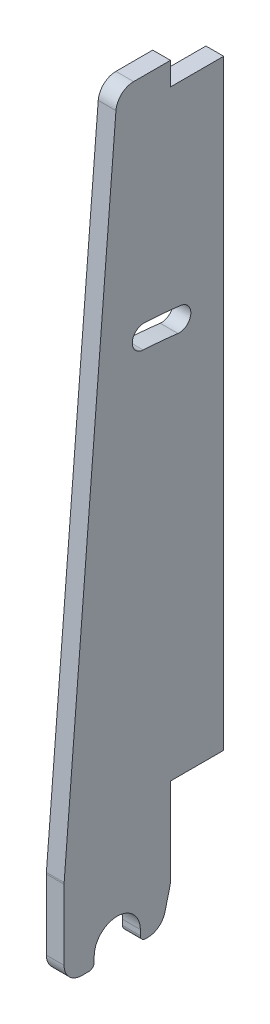
ISO-10303-21;
HEADER;
FILE_DESCRIPTION(('STEP AP214'),'2;1');
FILE_NAME('part.step','',(''),(''),'','','');
FILE_SCHEMA(('AUTOMOTIVE_DESIGN { 1 0 10303 214 1 1 1 1 }'));
ENDSEC;
DATA;
#1=APPLICATION_CONTEXT('core data for automotive mechanical design processes');
#2=APPLICATION_PROTOCOL_DEFINITION('international standard','automotive_design',2000,#1);
#3=PRODUCT_CONTEXT('',#1,'mechanical');
#4=PRODUCT('Part','Part','',(#3));
#5=PRODUCT_RELATED_PRODUCT_CATEGORY('part','',(#4));
#6=PRODUCT_DEFINITION_FORMATION('','',#4);
#7=PRODUCT_DEFINITION_CONTEXT('part definition',#1,'design');
#8=PRODUCT_DEFINITION('design','',#6,#7);
#9=PRODUCT_DEFINITION_SHAPE('','',#8);
#10=(LENGTH_UNIT() NAMED_UNIT(*) SI_UNIT(.MILLI.,.METRE.));
#11=(NAMED_UNIT(*) PLANE_ANGLE_UNIT() SI_UNIT($,.RADIAN.));
#12=(NAMED_UNIT(*) SI_UNIT($,.STERADIAN.) SOLID_ANGLE_UNIT());
#13=UNCERTAINTY_MEASURE_WITH_UNIT(LENGTH_MEASURE(1.E-05),#10,'distance_accuracy_value','');
#14=(GEOMETRIC_REPRESENTATION_CONTEXT(3) GLOBAL_UNCERTAINTY_ASSIGNED_CONTEXT((#13)) GLOBAL_UNIT_ASSIGNED_CONTEXT((#10,
#11,#12)) REPRESENTATION_CONTEXT('',''));
#15=CARTESIAN_POINT('',(0.,0.,0.));
#16=DIRECTION('',(0.,0.,1.));
#17=DIRECTION('',(1.,0.,0.));
#18=AXIS2_PLACEMENT_3D('',#15,#16,#17);
#19=CARTESIAN_POINT('',(5.,352.,-30.));
#20=DIRECTION('',(0.,0.,1.));
#21=DIRECTION('',(0.,-1.,0.));
#22=AXIS2_PLACEMENT_3D('',#19,#20,#21);
#23=PLANE('',#22);
#24=DIRECTION('',(0.,1.,0.));
#25=VECTOR('',#24,1.);
#26=CARTESIAN_POINT('',(-5.,352.,-30.));
#27=LINE('',#26,#25);
#28=CARTESIAN_POINT('',(-5.,0.,-30.));
#29=VERTEX_POINT('',#28);
#30=CARTESIAN_POINT('',(-5.,339.,-30.));
#31=VERTEX_POINT('',#30);
#32=EDGE_CURVE('E325',#29,#31,#27,.T.);
#33=ORIENTED_EDGE('',*,*,#32,.T.);
#34=DIRECTION('',(1.,0.,0.));
#35=VECTOR('',#34,1.);
#36=CARTESIAN_POINT('',(-5.,339.,-30.));
#37=LINE('',#36,#35);
#38=CARTESIAN_POINT('',(5.,339.,-30.));
#39=VERTEX_POINT('',#38);
#40=EDGE_CURVE('E321',#31,#39,#37,.T.);
#41=ORIENTED_EDGE('',*,*,#40,.T.);
#42=DIRECTION('',(0.,1.,0.));
#43=VECTOR('',#42,1.);
#44=CARTESIAN_POINT('',(5.,352.,-30.));
#45=LINE('',#44,#43);
#46=CARTESIAN_POINT('',(5.,0.,-30.));
#47=VERTEX_POINT('',#46);
#48=EDGE_CURVE('E331',#47,#39,#45,.T.);
#49=ORIENTED_EDGE('',*,*,#48,.F.);
#50=DIRECTION('',(-1.,0.,0.));
#51=VECTOR('',#50,1.);
#52=CARTESIAN_POINT('',(5.,0.,-30.));
#53=LINE('',#52,#51);
#54=EDGE_CURVE('E374',#47,#29,#53,.T.);
#55=ORIENTED_EDGE('',*,*,#54,.T.);
#56=EDGE_LOOP('',(#33,#41,#49,#55));
#57=FACE_BOUND('',#56,.T.);
#58=ADVANCED_FACE('F47',(#57),#23,.F.);
#59=CARTESIAN_POINT('',(5.,352.,30.));
#60=DIRECTION('',(0.,-1.,0.));
#61=DIRECTION('',(0.,0.,-1.));
#62=AXIS2_PLACEMENT_3D('',#59,#60,#61);
#63=PLANE('',#62);
#64=DIRECTION('',(0.,0.,1.));
#65=VECTOR('',#64,1.);
#66=CARTESIAN_POINT('',(5.,352.,30.));
#67=LINE('',#66,#65);
#68=CARTESIAN_POINT('',(5.,352.,0.));
#69=VERTEX_POINT('',#68);
#70=CARTESIAN_POINT('',(5.,352.,20.7739861031717));
#71=VERTEX_POINT('',#70);
#72=EDGE_CURVE('E335',#69,#71,#67,.T.);
#73=ORIENTED_EDGE('',*,*,#72,.F.);
#74=DIRECTION('',(1.,0.,0.));
#75=VECTOR('',#74,1.);
#76=CARTESIAN_POINT('',(-5.,352.,0.));
#77=LINE('',#76,#75);
#78=CARTESIAN_POINT('',(-5.,352.,0.));
#79=VERTEX_POINT('',#78);
#80=EDGE_CURVE('E315',#79,#69,#77,.T.);
#81=ORIENTED_EDGE('',*,*,#80,.F.);
#82=DIRECTION('',(0.,0.,1.));
#83=VECTOR('',#82,1.);
#84=CARTESIAN_POINT('',(-5.,352.,30.));
#85=LINE('',#84,#83);
#86=CARTESIAN_POINT('',(-5.,352.,20.7739861031717));
#87=VERTEX_POINT('',#86);
#88=EDGE_CURVE('E378',#79,#87,#85,.T.);
#89=ORIENTED_EDGE('',*,*,#88,.T.);
#90=DIRECTION('',(-1.,0.,0.));
#91=VECTOR('',#90,1.);
#92=CARTESIAN_POINT('',(5.,352.,20.7739861031717));
#93=LINE('',#92,#91);
#94=EDGE_CURVE('E495',#87,#71,#93,.F.);
#95=ORIENTED_EDGE('',*,*,#94,.T.);
#96=EDGE_LOOP('',(#73,#81,#89,#95));
#97=FACE_BOUND('',#96,.T.);
#98=ADVANCED_FACE('F584',(#97),#63,.F.);
#99=CARTESIAN_POINT('',(5.,-20.,60.));
#100=DIRECTION('',(0.,-0.0803841899203099,-0.996763955011845));
#101=DIRECTION('',(0.,0.996763955011845,-0.0803841899203099));
#102=AXIS2_PLACEMENT_3D('',#99,#100,#101);
#103=PLANE('',#102);
#104=DIRECTION('',(0.,-0.996763955011845,0.0803841899203099));
#105=VECTOR('',#104,1.);
#106=CARTESIAN_POINT('',(-5.,-20.,60.));
#107=LINE('',#106,#105);
#108=CARTESIAN_POINT('',(-5.,342.803841899203,30.7416256532901));
#109=VERTEX_POINT('',#108);
#110=CARTESIAN_POINT('',(-5.,-19.5987304214688,59.9676395501184));
#111=VERTEX_POINT('',#110);
#112=EDGE_CURVE('E381',#109,#111,#107,.T.);
#113=ORIENTED_EDGE('',*,*,#112,.T.);
#114=DIRECTION('',(-1.,0.,0.));
#115=VECTOR('',#114,1.);
#116=CARTESIAN_POINT('',(5.,-19.5987304214688,59.9676395501184));
#117=LINE('',#116,#115);
#118=CARTESIAN_POINT('',(5.,-19.5987304214688,59.9676395501184));
#119=VERTEX_POINT('',#118);
#120=EDGE_CURVE('E458',#111,#119,#117,.F.);
#121=ORIENTED_EDGE('',*,*,#120,.T.);
#122=DIRECTION('',(0.,-0.996763955011845,0.0803841899203099));
#123=VECTOR('',#122,1.);
#124=CARTESIAN_POINT('',(5.,-20.,60.));
#125=LINE('',#124,#123);
#126=CARTESIAN_POINT('',(5.,342.803841899203,30.7416256532901));
#127=VERTEX_POINT('',#126);
#128=EDGE_CURVE('E339',#127,#119,#125,.T.);
#129=ORIENTED_EDGE('',*,*,#128,.F.);
#130=DIRECTION('',(-1.,0.,0.));
#131=VECTOR('',#130,1.);
#132=CARTESIAN_POINT('',(5.,342.803841899203,30.7416256532901));
#133=LINE('',#132,#131);
#134=EDGE_CURVE('E454',#127,#109,#133,.T.);
#135=ORIENTED_EDGE('',*,*,#134,.T.);
#136=EDGE_LOOP('',(#113,#121,#129,#135));
#137=FACE_BOUND('',#136,.T.);
#138=ADVANCED_FACE('F592',(#137),#103,.F.);
#139=CARTESIAN_POINT('',(5.,-70.,60.));
#140=DIRECTION('',(0.,0.,-1.));
#141=DIRECTION('',(0.,1.,0.));
#142=AXIS2_PLACEMENT_3D('',#139,#140,#141);
#143=PLANE('',#142);
#144=DIRECTION('',(0.,-1.,0.));
#145=VECTOR('',#144,1.);
#146=CARTESIAN_POINT('',(5.,-70.,60.));
#147=LINE('',#146,#145);
#148=CARTESIAN_POINT('',(5.,-20.4025723206719,60.));
#149=VERTEX_POINT('',#148);
#150=CARTESIAN_POINT('',(5.,-60.,60.));
#151=VERTEX_POINT('',#150);
#152=EDGE_CURVE('E343',#149,#151,#147,.T.);
#153=ORIENTED_EDGE('',*,*,#152,.F.);
#154=DIRECTION('',(-1.,0.,0.));
#155=VECTOR('',#154,1.);
#156=CARTESIAN_POINT('',(5.,-20.4025723206719,60.));
#157=LINE('',#156,#155);
#158=CARTESIAN_POINT('',(-5.,-20.4025723206719,60.));
#159=VERTEX_POINT('',#158);
#160=EDGE_CURVE('E433',#149,#159,#157,.T.);
#161=ORIENTED_EDGE('',*,*,#160,.T.);
#162=DIRECTION('',(0.,-1.,0.));
#163=VECTOR('',#162,1.);
#164=CARTESIAN_POINT('',(-5.,-70.,60.));
#165=LINE('',#164,#163);
#166=CARTESIAN_POINT('',(-5.,-60.,60.));
#167=VERTEX_POINT('',#166);
#168=EDGE_CURVE('E385',#159,#167,#165,.T.);
#169=ORIENTED_EDGE('',*,*,#168,.T.);
#170=DIRECTION('',(-1.,0.,0.));
#171=VECTOR('',#170,1.);
#172=CARTESIAN_POINT('',(5.,-60.,60.));
#173=LINE('',#172,#171);
#174=EDGE_CURVE('E430',#167,#151,#173,.F.);
#175=ORIENTED_EDGE('',*,*,#174,.T.);
#176=EDGE_LOOP('',(#153,#161,#169,#175));
#177=FACE_BOUND('',#176,.T.);
#178=ADVANCED_FACE('F603',(#177),#143,.F.);
#179=CARTESIAN_POINT('',(5.,-70.,43.));
#180=DIRECTION('',(0.,1.,0.));
#181=DIRECTION('',(0.,0.,1.));
#182=AXIS2_PLACEMENT_3D('',#179,#180,#181);
#183=PLANE('',#182);
#184=DIRECTION('',(0.,0.,-1.));
#185=VECTOR('',#184,1.);
#186=CARTESIAN_POINT('',(-5.,-70.,43.));
#187=LINE('',#186,#185);
#188=CARTESIAN_POINT('',(-5.,-70.,50.));
#189=VERTEX_POINT('',#188);
#190=CARTESIAN_POINT('',(-5.,-70.,46.));
#191=VERTEX_POINT('',#190);
#192=EDGE_CURVE('E389',#189,#191,#187,.T.);
#193=ORIENTED_EDGE('',*,*,#192,.T.);
#194=DIRECTION('',(-1.,0.,0.));
#195=VECTOR('',#194,1.);
#196=CARTESIAN_POINT('',(5.,-70.,46.));
#197=LINE('',#196,#195);
#198=CARTESIAN_POINT('',(5.,-70.,46.));
#199=VERTEX_POINT('',#198);
#200=EDGE_CURVE('E11',#191,#199,#197,.F.);
#201=ORIENTED_EDGE('',*,*,#200,.T.);
#202=DIRECTION('',(0.,0.,-1.));
#203=VECTOR('',#202,1.);
#204=CARTESIAN_POINT('',(5.,-70.,43.));
#205=LINE('',#204,#203);
#206=CARTESIAN_POINT('',(5.,-70.,50.));
#207=VERTEX_POINT('',#206);
#208=EDGE_CURVE('E347',#207,#199,#205,.T.);
#209=ORIENTED_EDGE('',*,*,#208,.F.);
#210=DIRECTION('',(-1.,0.,0.));
#211=VECTOR('',#210,1.);
#212=CARTESIAN_POINT('',(5.,-70.,50.));
#213=LINE('',#212,#211);
#214=EDGE_CURVE('E476',#207,#189,#213,.T.);
#215=ORIENTED_EDGE('',*,*,#214,.T.);
#216=EDGE_LOOP('',(#193,#201,#209,#215));
#217=FACE_BOUND('',#216,.T.);
#218=ADVANCED_FACE('F610',(#217),#183,.F.);
#219=CARTESIAN_POINT('',(5.,-64.,43.));
#220=DIRECTION('',(0.,0.,1.));
#221=DIRECTION('',(0.,-1.,0.));
#222=AXIS2_PLACEMENT_3D('',#219,#220,#221);
#223=PLANE('',#222);
#224=DIRECTION('',(0.,1.,0.));
#225=VECTOR('',#224,1.);
#226=CARTESIAN_POINT('',(5.,-64.,43.));
#227=LINE('',#226,#225);
#228=CARTESIAN_POINT('',(5.,-67.,43.));
#229=VERTEX_POINT('',#228);
#230=CARTESIAN_POINT('',(5.,-64.,43.));
#231=VERTEX_POINT('',#230);
#232=EDGE_CURVE('E351',#229,#231,#227,.T.);
#233=ORIENTED_EDGE('',*,*,#232,.F.);
#234=DIRECTION('',(-1.,0.,0.));
#235=VECTOR('',#234,1.);
#236=CARTESIAN_POINT('',(5.,-67.,43.));
#237=LINE('',#236,#235);
#238=CARTESIAN_POINT('',(-5.,-67.,43.));
#239=VERTEX_POINT('',#238);
#240=EDGE_CURVE('E56',#229,#239,#237,.T.);
#241=ORIENTED_EDGE('',*,*,#240,.T.);
#242=DIRECTION('',(0.,1.,0.));
#243=VECTOR('',#242,1.);
#244=CARTESIAN_POINT('',(-5.,-64.,43.));
#245=LINE('',#244,#243);
#246=CARTESIAN_POINT('',(-5.,-64.,43.));
#247=VERTEX_POINT('',#246);
#248=EDGE_CURVE('E393',#239,#247,#245,.T.);
#249=ORIENTED_EDGE('',*,*,#248,.T.);
#250=DIRECTION('',(-1.,0.,0.));
#251=VECTOR('',#250,1.);
#252=CARTESIAN_POINT('',(5.,-64.,43.));
#253=LINE('',#252,#251);
#254=EDGE_CURVE('E426',#231,#247,#253,.T.);
#255=ORIENTED_EDGE('',*,*,#254,.F.);
#256=EDGE_LOOP('',(#233,#241,#249,#255));
#257=FACE_BOUND('',#256,.T.);
#258=ADVANCED_FACE('F523',(#257),#223,.F.);
#259=CARTESIAN_POINT('',(5.,-64.,30.));
#260=DIRECTION('',(-1.,0.,0.));
#261=DIRECTION('',(0.,0.,1.));
#262=AXIS2_PLACEMENT_3D('',#259,#260,#261);
#263=CYLINDRICAL_SURFACE('',#262,13.);
#264=CARTESIAN_POINT('',(-5.,-64.,30.));
#265=DIRECTION('',(-1.,0.,0.));
#266=DIRECTION('',(0.,0.,1.));
#267=AXIS2_PLACEMENT_3D('',#264,#265,#266);
#268=CIRCLE('',#267,13.);
#269=CARTESIAN_POINT('',(-5.,-64.,17.));
#270=VERTEX_POINT('',#269);
#271=EDGE_CURVE('E396',#247,#270,#268,.T.);
#272=ORIENTED_EDGE('',*,*,#271,.T.);
#273=DIRECTION('',(-1.,0.,0.));
#274=VECTOR('',#273,1.);
#275=CARTESIAN_POINT('',(5.,-64.,17.));
#276=LINE('',#275,#274);
#277=CARTESIAN_POINT('',(5.,-64.,17.));
#278=VERTEX_POINT('',#277);
#279=EDGE_CURVE('E422',#278,#270,#276,.T.);
#280=ORIENTED_EDGE('',*,*,#279,.F.);
#281=CARTESIAN_POINT('',(5.,-64.,30.));
#282=DIRECTION('',(-1.,0.,0.));
#283=DIRECTION('',(0.,0.,1.));
#284=AXIS2_PLACEMENT_3D('',#281,#282,#283);
#285=CIRCLE('',#284,13.);
#286=EDGE_CURVE('E354',#231,#278,#285,.T.);
#287=ORIENTED_EDGE('',*,*,#286,.F.);
#288=ORIENTED_EDGE('',*,*,#254,.T.);
#289=EDGE_LOOP('',(#272,#280,#287,#288));
#290=FACE_BOUND('',#289,.T.);
#291=ADVANCED_FACE('F532',(#290),#263,.F.);
#292=CARTESIAN_POINT('',(5.,-64.,17.));
#293=DIRECTION('',(0.,0.,-1.));
#294=DIRECTION('',(-1.,0.,0.));
#295=AXIS2_PLACEMENT_3D('',#292,#293,#294);
#296=PLANE('',#295);
#297=DIRECTION('',(0.,-1.,0.));
#298=VECTOR('',#297,1.);
#299=CARTESIAN_POINT('',(-5.,-64.,17.));
#300=LINE('',#299,#298);
#301=CARTESIAN_POINT('',(-5.,-67.,17.));
#302=VERTEX_POINT('',#301);
#303=EDGE_CURVE('E399',#270,#302,#300,.T.);
#304=ORIENTED_EDGE('',*,*,#303,.T.);
#305=DIRECTION('',(-1.,0.,0.));
#306=VECTOR('',#305,1.);
#307=CARTESIAN_POINT('',(5.,-67.,17.));
#308=LINE('',#307,#306);
#309=CARTESIAN_POINT('',(5.,-67.,17.));
#310=VERTEX_POINT('',#309);
#311=EDGE_CURVE('E509',#302,#310,#308,.F.);
#312=ORIENTED_EDGE('',*,*,#311,.T.);
#313=DIRECTION('',(0.,-1.,0.));
#314=VECTOR('',#313,1.);
#315=CARTESIAN_POINT('',(5.,-64.,17.));
#316=LINE('',#315,#314);
#317=EDGE_CURVE('E357',#278,#310,#316,.T.);
#318=ORIENTED_EDGE('',*,*,#317,.F.);
#319=ORIENTED_EDGE('',*,*,#279,.T.);
#320=EDGE_LOOP('',(#304,#312,#318,#319));
#321=FACE_BOUND('',#320,.T.);
#322=ADVANCED_FACE('F536',(#321),#296,.F.);
#323=CARTESIAN_POINT('',(5.,-70.,4.99999999999999));
#324=DIRECTION('',(0.,1.,0.));
#325=DIRECTION('',(0.,0.,1.));
#326=AXIS2_PLACEMENT_3D('',#323,#324,#325);
#327=PLANE('',#326);
#328=DIRECTION('',(0.,0.,-1.));
#329=VECTOR('',#328,1.);
#330=CARTESIAN_POINT('',(5.,-70.,4.99999999999999));
#331=LINE('',#330,#329);
#332=CARTESIAN_POINT('',(5.,-70.,14.));
#333=VERTEX_POINT('',#332);
#334=CARTESIAN_POINT('',(5.,-70.,12.8077640640441));
#335=VERTEX_POINT('',#334);
#336=EDGE_CURVE('E361',#333,#335,#331,.T.);
#337=ORIENTED_EDGE('',*,*,#336,.F.);
#338=DIRECTION('',(-1.,0.,0.));
#339=VECTOR('',#338,1.);
#340=CARTESIAN_POINT('',(5.,-70.,14.));
#341=LINE('',#340,#339);
#342=CARTESIAN_POINT('',(-5.,-70.,14.));
#343=VERTEX_POINT('',#342);
#344=EDGE_CURVE('E499',#333,#343,#341,.T.);
#345=ORIENTED_EDGE('',*,*,#344,.T.);
#346=DIRECTION('',(0.,0.,-1.));
#347=VECTOR('',#346,1.);
#348=CARTESIAN_POINT('',(-5.,-70.,4.99999999999999));
#349=LINE('',#348,#347);
#350=CARTESIAN_POINT('',(-5.,-70.,12.8077640640441));
#351=VERTEX_POINT('',#350);
#352=EDGE_CURVE('E403',#343,#351,#349,.T.);
#353=ORIENTED_EDGE('',*,*,#352,.T.);
#354=DIRECTION('',(-1.,0.,0.));
#355=VECTOR('',#354,1.);
#356=CARTESIAN_POINT('',(5.,-70.,12.8077640640441));
#357=LINE('',#356,#355);
#358=EDGE_CURVE('E487',#351,#335,#357,.F.);
#359=ORIENTED_EDGE('',*,*,#358,.T.);
#360=EDGE_LOOP('',(#337,#345,#353,#359));
#361=FACE_BOUND('',#360,.T.);
#362=ADVANCED_FACE('F547',(#361),#327,.F.);
#363=CARTESIAN_POINT('',(5.,-50.,0.));
#364=DIRECTION('',(0.,0.242535625036333,0.970142500145332));
#365=DIRECTION('',(0.,-0.970142500145332,0.242535625036333));
#366=AXIS2_PLACEMENT_3D('',#363,#364,#365);
#367=PLANE('',#366);
#368=DIRECTION('',(0.,0.970142500145332,-0.242535625036333));
#369=VECTOR('',#368,1.);
#370=CARTESIAN_POINT('',(5.,-50.,0.));
#371=LINE('',#370,#369);
#372=CARTESIAN_POINT('',(5.,-62.4253562503633,3.10633906259082));
#373=VERTEX_POINT('',#372);
#374=CARTESIAN_POINT('',(5.,-51.1942999941867,0.298574998546676));
#375=VERTEX_POINT('',#374);
#376=EDGE_CURVE('E364',#373,#375,#371,.T.);
#377=ORIENTED_EDGE('',*,*,#376,.F.);
#378=DIRECTION('',(-1.,0.,0.));
#379=VECTOR('',#378,1.);
#380=CARTESIAN_POINT('',(5.,-62.4253562503633,3.10633906259082));
#381=LINE('',#380,#379);
#382=CARTESIAN_POINT('',(-5.,-62.4253562503633,3.10633906259082));
#383=VERTEX_POINT('',#382);
#384=EDGE_CURVE('E483',#373,#383,#381,.T.);
#385=ORIENTED_EDGE('',*,*,#384,.T.);
#386=DIRECTION('',(0.,0.970142500145332,-0.242535625036333));
#387=VECTOR('',#386,1.);
#388=CARTESIAN_POINT('',(-5.,-50.,0.));
#389=LINE('',#388,#387);
#390=CARTESIAN_POINT('',(-5.,-51.1942999941867,0.298574998546676));
#391=VERTEX_POINT('',#390);
#392=EDGE_CURVE('E406',#383,#391,#389,.T.);
#393=ORIENTED_EDGE('',*,*,#392,.T.);
#394=DIRECTION('',(-1.,0.,0.));
#395=VECTOR('',#394,1.);
#396=CARTESIAN_POINT('',(5.,-51.1942999941867,0.298574998546676));
#397=LINE('',#396,#395);
#398=EDGE_CURVE('E480',#391,#375,#397,.F.);
#399=ORIENTED_EDGE('',*,*,#398,.T.);
#400=EDGE_LOOP('',(#377,#385,#393,#399));
#401=FACE_BOUND('',#400,.T.);
#402=ADVANCED_FACE('F557',(#401),#367,.F.);
#403=CARTESIAN_POINT('',(5.,0.,0.));
#404=DIRECTION('',(0.,0.,1.));
#405=DIRECTION('',(0.,-1.,0.));
#406=AXIS2_PLACEMENT_3D('',#403,#404,#405);
#407=PLANE('',#406);
#408=DIRECTION('',(0.,1.,0.));
#409=VECTOR('',#408,1.);
#410=CARTESIAN_POINT('',(5.,0.,0.));
#411=LINE('',#410,#409);
#412=CARTESIAN_POINT('',(5.,-48.7689437438234,0.));
#413=VERTEX_POINT('',#412);
#414=CARTESIAN_POINT('',(5.,0.,0.));
#415=VERTEX_POINT('',#414);
#416=EDGE_CURVE('E368',#413,#415,#411,.T.);
#417=ORIENTED_EDGE('',*,*,#416,.F.);
#418=DIRECTION('',(-1.,0.,0.));
#419=VECTOR('',#418,1.);
#420=CARTESIAN_POINT('',(5.,-48.7689437438234,0.));
#421=LINE('',#420,#419);
#422=CARTESIAN_POINT('',(-5.,-48.7689437438234,0.));
#423=VERTEX_POINT('',#422);
#424=EDGE_CURVE('E491',#413,#423,#421,.T.);
#425=ORIENTED_EDGE('',*,*,#424,.T.);
#426=DIRECTION('',(0.,1.,0.));
#427=VECTOR('',#426,1.);
#428=CARTESIAN_POINT('',(-5.,0.,0.));
#429=LINE('',#428,#427);
#430=CARTESIAN_POINT('',(-5.,0.,0.));
#431=VERTEX_POINT('',#430);
#432=EDGE_CURVE('E410',#423,#431,#429,.T.);
#433=ORIENTED_EDGE('',*,*,#432,.T.);
#434=DIRECTION('',(-1.,0.,0.));
#435=VECTOR('',#434,1.);
#436=CARTESIAN_POINT('',(5.,0.,0.));
#437=LINE('',#436,#435);
#438=EDGE_CURVE('E418',#415,#431,#437,.T.);
#439=ORIENTED_EDGE('',*,*,#438,.F.);
#440=EDGE_LOOP('',(#417,#425,#433,#439));
#441=FACE_BOUND('',#440,.T.);
#442=ADVANCED_FACE('F565',(#441),#407,.F.);
#443=CARTESIAN_POINT('',(5.,0.,-30.));
#444=DIRECTION('',(0.,1.,0.));
#445=DIRECTION('',(0.,0.,1.));
#446=AXIS2_PLACEMENT_3D('',#443,#444,#445);
#447=PLANE('',#446);
#448=DIRECTION('',(0.,0.,-1.));
#449=VECTOR('',#448,1.);
#450=CARTESIAN_POINT('',(-5.,0.,-30.));
#451=LINE('',#450,#449);
#452=EDGE_CURVE('E336',#431,#29,#451,.T.);
#453=ORIENTED_EDGE('',*,*,#452,.T.);
#454=ORIENTED_EDGE('',*,*,#54,.F.);
#455=DIRECTION('',(0.,0.,-1.));
#456=VECTOR('',#455,1.);
#457=CARTESIAN_POINT('',(5.,0.,-30.));
#458=LINE('',#457,#456);
#459=EDGE_CURVE('E371',#415,#47,#458,.T.);
#460=ORIENTED_EDGE('',*,*,#459,.F.);
#461=ORIENTED_EDGE('',*,*,#438,.T.);
#462=EDGE_LOOP('',(#453,#454,#460,#461));
#463=FACE_BOUND('',#462,.T.);
#464=ADVANCED_FACE('F571',(#463),#447,.F.);
#465=CARTESIAN_POINT('',(5.,-64.,30.));
#466=DIRECTION('',(-1.,0.,0.));
#467=DIRECTION('',(0.,0.,1.));
#468=AXIS2_PLACEMENT_3D('',#465,#466,#467);
#469=PLANE('',#468);
#470=CARTESIAN_POINT('',(5.,-64.,30.));
#471=DIRECTION('',(1.,0.,0.));
#472=DIRECTION('',(0.,0.,-1.));
#473=AXIS2_PLACEMENT_3D('',#470,#471,#472);
#474=CIRCLE('',#473,295.583033054519);
#475=CARTESIAN_POINT('',(5.,229.410506158611,-5.77155721318653));
#476=VERTEX_POINT('',#475);
#477=CARTESIAN_POINT('',(5.,231.185653535888,14.6781405730391));
#478=VERTEX_POINT('',#477);
#479=EDGE_CURVE('E66',#476,#478,#474,.T.);
#480=ORIENTED_EDGE('',*,*,#479,.F.);
#481=CARTESIAN_POINT('',(5.,222.958280973957,-4.9849250459646));
#482=DIRECTION('',(1.,0.,0.));
#483=DIRECTION('',(0.,0.,-1.));
#484=AXIS2_PLACEMENT_3D('',#481,#482,#483);
#485=CIRCLE('',#484,6.49999999999997);
#486=CARTESIAN_POINT('',(5.,216.506055789302,-4.19829287874265));
#487=VERTEX_POINT('',#486);
#488=EDGE_CURVE('E261',#487,#476,#485,.T.);
#489=ORIENTED_EDGE('',*,*,#488,.F.);
#490=CARTESIAN_POINT('',(5.,-64.,30.));
#491=DIRECTION('',(-1.,0.,0.));
#492=DIRECTION('',(0.,0.,-1.));
#493=AXIS2_PLACEMENT_3D('',#490,#491,#492);
#494=CIRCLE('',#493,282.583033054519);
#495=CARTESIAN_POINT('',(5.,218.203130634248,15.3520093350318));
#496=VERTEX_POINT('',#495);
#497=EDGE_CURVE('E282',#496,#487,#494,.T.);
#498=ORIENTED_EDGE('',*,*,#497,.F.);
#499=CARTESIAN_POINT('',(5.,224.694392085068,15.0150749540354));
#500=DIRECTION('',(1.,0.,0.));
#501=DIRECTION('',(0.,0.,-1.));
#502=AXIS2_PLACEMENT_3D('',#499,#500,#501);
#503=CIRCLE('',#502,6.49999999999997);
#504=EDGE_CURVE('E285',#478,#496,#503,.T.);
#505=ORIENTED_EDGE('',*,*,#504,.F.);
#506=EDGE_LOOP('',(#480,#489,#498,#505));
#507=FACE_BOUND('',#506,.T.);
#508=ORIENTED_EDGE('',*,*,#48,.T.);
#509=DIRECTION('',(0.,0.,-1.));
#510=VECTOR('',#509,1.);
#511=CARTESIAN_POINT('',(5.,339.,-30.));
#512=LINE('',#511,#510);
#513=CARTESIAN_POINT('',(5.,339.,0.));
#514=VERTEX_POINT('',#513);
#515=EDGE_CURVE('E312',#514,#39,#512,.T.);
#516=ORIENTED_EDGE('',*,*,#515,.F.);
#517=DIRECTION('',(0.,-1.,0.));
#518=VECTOR('',#517,1.);
#519=CARTESIAN_POINT('',(5.,339.,0.));
#520=LINE('',#519,#518);
#521=EDGE_CURVE('E302',#69,#514,#520,.T.);
#522=ORIENTED_EDGE('',*,*,#521,.F.);
#523=ORIENTED_EDGE('',*,*,#72,.T.);
#524=CARTESIAN_POINT('',(5.,342.,20.7739861031717));
#525=DIRECTION('',(-1.,0.,0.));
#526=DIRECTION('',(0.,0.,1.));
#527=AXIS2_PLACEMENT_3D('',#524,#525,#526);
#528=CIRCLE('',#527,10.);
#529=EDGE_CURVE('E461',#71,#127,#528,.F.);
#530=ORIENTED_EDGE('',*,*,#529,.T.);
#531=ORIENTED_EDGE('',*,*,#128,.T.);
#532=CARTESIAN_POINT('',(5.,-20.4025723206719,50.));
#533=DIRECTION('',(-1.,0.,0.));
#534=DIRECTION('',(0.,0.,1.));
#535=AXIS2_PLACEMENT_3D('',#532,#533,#534);
#536=CIRCLE('',#535,10.);
#537=EDGE_CURVE('E473',#119,#149,#536,.F.);
#538=ORIENTED_EDGE('',*,*,#537,.T.);
#539=ORIENTED_EDGE('',*,*,#152,.T.);
#540=CARTESIAN_POINT('',(5.,-60.,50.));
#541=DIRECTION('',(-1.,0.,0.));
#542=DIRECTION('',(0.,0.,1.));
#543=AXIS2_PLACEMENT_3D('',#540,#541,#542);
#544=CIRCLE('',#543,10.);
#545=EDGE_CURVE('E470',#151,#207,#544,.F.);
#546=ORIENTED_EDGE('',*,*,#545,.T.);
#547=ORIENTED_EDGE('',*,*,#208,.T.);
#548=CARTESIAN_POINT('',(5.,-67.,46.));
#549=DIRECTION('',(-1.,0.,0.));
#550=DIRECTION('',(0.,0.,1.));
#551=AXIS2_PLACEMENT_3D('',#548,#549,#550);
#552=CIRCLE('',#551,3.);
#553=EDGE_CURVE('E512',#199,#229,#552,.F.);
#554=ORIENTED_EDGE('',*,*,#553,.T.);
#555=ORIENTED_EDGE('',*,*,#232,.T.);
#556=ORIENTED_EDGE('',*,*,#286,.T.);
#557=ORIENTED_EDGE('',*,*,#317,.T.);
#558=CARTESIAN_POINT('',(5.,-67.,14.));
#559=DIRECTION('',(-1.,0.,0.));
#560=DIRECTION('',(0.,0.,1.));
#561=AXIS2_PLACEMENT_3D('',#558,#559,#560);
#562=CIRCLE('',#561,3.);
#563=EDGE_CURVE('E515',#310,#333,#562,.F.);
#564=ORIENTED_EDGE('',*,*,#563,.T.);
#565=ORIENTED_EDGE('',*,*,#336,.T.);
#566=CARTESIAN_POINT('',(5.,-60.,12.8077640640441));
#567=DIRECTION('',(-1.,0.,0.));
#568=DIRECTION('',(0.,0.,1.));
#569=AXIS2_PLACEMENT_3D('',#566,#567,#568);
#570=CIRCLE('',#569,10.);
#571=EDGE_CURVE('E467',#335,#373,#570,.F.);
#572=ORIENTED_EDGE('',*,*,#571,.T.);
#573=ORIENTED_EDGE('',*,*,#376,.T.);
#574=CARTESIAN_POINT('',(5.,-48.7689437438234,9.99999999999999));
#575=DIRECTION('',(-1.,0.,0.));
#576=DIRECTION('',(0.,0.,1.));
#577=AXIS2_PLACEMENT_3D('',#574,#575,#576);
#578=CIRCLE('',#577,10.);
#579=EDGE_CURVE('E464',#375,#413,#578,.F.);
#580=ORIENTED_EDGE('',*,*,#579,.T.);
#581=ORIENTED_EDGE('',*,*,#416,.T.);
#582=ORIENTED_EDGE('',*,*,#459,.T.);
#583=EDGE_LOOP('',(#508,#516,#522,#523,#530,#531,#538,#539,#546,#547,#554,#555,#556,#557,#564,
#565,#572,#573,#580,#581,#582));
#584=FACE_BOUND('',#583,.T.);
#585=ADVANCED_FACE('F540',(#507,#584),#469,.F.);
#586=CARTESIAN_POINT('',(-5.,-64.,30.));
#587=DIRECTION('',(-1.,0.,0.));
#588=DIRECTION('',(0.,0.,1.));
#589=AXIS2_PLACEMENT_3D('',#586,#587,#588);
#590=PLANE('',#589);
#591=CARTESIAN_POINT('',(-5.,222.958280973957,-4.9849250459646));
#592=DIRECTION('',(1.,0.,0.));
#593=DIRECTION('',(0.,0.,-1.));
#594=AXIS2_PLACEMENT_3D('',#591,#592,#593);
#595=CIRCLE('',#594,6.49999999999997);
#596=CARTESIAN_POINT('',(-5.,216.506055789302,-4.19829287874265));
#597=VERTEX_POINT('',#596);
#598=CARTESIAN_POINT('',(-5.,229.410506158611,-5.77155721318653));
#599=VERTEX_POINT('',#598);
#600=EDGE_CURVE('E260',#597,#599,#595,.T.);
#601=ORIENTED_EDGE('',*,*,#600,.T.);
#602=CARTESIAN_POINT('',(-5.,-64.,30.));
#603=DIRECTION('',(1.,0.,0.));
#604=DIRECTION('',(0.,0.,-1.));
#605=AXIS2_PLACEMENT_3D('',#602,#603,#604);
#606=CIRCLE('',#605,295.583033054519);
#607=CARTESIAN_POINT('',(-5.,231.185653535888,14.6781405730391));
#608=VERTEX_POINT('',#607);
#609=EDGE_CURVE('E268',#599,#608,#606,.T.);
#610=ORIENTED_EDGE('',*,*,#609,.T.);
#611=CARTESIAN_POINT('',(-5.,224.694392085068,15.0150749540354));
#612=DIRECTION('',(1.,0.,0.));
#613=DIRECTION('',(0.,0.,-1.));
#614=AXIS2_PLACEMENT_3D('',#611,#612,#613);
#615=CIRCLE('',#614,6.49999999999997);
#616=CARTESIAN_POINT('',(-5.,218.203130634248,15.3520093350318));
#617=VERTEX_POINT('',#616);
#618=EDGE_CURVE('E275',#608,#617,#615,.T.);
#619=ORIENTED_EDGE('',*,*,#618,.T.);
#620=CARTESIAN_POINT('',(-5.,-64.,30.));
#621=DIRECTION('',(-1.,0.,0.));
#622=DIRECTION('',(0.,0.,-1.));
#623=AXIS2_PLACEMENT_3D('',#620,#621,#622);
#624=CIRCLE('',#623,282.583033054519);
#625=EDGE_CURVE('E265',#617,#597,#624,.T.);
#626=ORIENTED_EDGE('',*,*,#625,.T.);
#627=EDGE_LOOP('',(#601,#610,#619,#626));
#628=FACE_BOUND('',#627,.T.);
#629=DIRECTION('',(0.,0.,-1.));
#630=VECTOR('',#629,1.);
#631=CARTESIAN_POINT('',(-5.,339.,-30.));
#632=LINE('',#631,#630);
#633=CARTESIAN_POINT('',(-5.,339.,0.));
#634=VERTEX_POINT('',#633);
#635=EDGE_CURVE('E74',#634,#31,#632,.T.);
#636=ORIENTED_EDGE('',*,*,#635,.T.);
#637=ORIENTED_EDGE('',*,*,#32,.F.);
#638=ORIENTED_EDGE('',*,*,#452,.F.);
#639=ORIENTED_EDGE('',*,*,#432,.F.);
#640=CARTESIAN_POINT('',(-5.,-48.7689437438234,9.99999999999999));
#641=DIRECTION('',(-1.,0.,0.));
#642=DIRECTION('',(0.,0.,1.));
#643=AXIS2_PLACEMENT_3D('',#640,#641,#642);
#644=CIRCLE('',#643,10.);
#645=EDGE_CURVE('E441',#423,#391,#644,.T.);
#646=ORIENTED_EDGE('',*,*,#645,.T.);
#647=ORIENTED_EDGE('',*,*,#392,.F.);
#648=CARTESIAN_POINT('',(-5.,-60.,12.8077640640441));
#649=DIRECTION('',(-1.,0.,0.));
#650=DIRECTION('',(0.,0.,1.));
#651=AXIS2_PLACEMENT_3D('',#648,#649,#650);
#652=CIRCLE('',#651,10.);
#653=EDGE_CURVE('E444',#383,#351,#652,.T.);
#654=ORIENTED_EDGE('',*,*,#653,.T.);
#655=ORIENTED_EDGE('',*,*,#352,.F.);
#656=CARTESIAN_POINT('',(-5.,-67.,14.));
#657=DIRECTION('',(-1.,0.,0.));
#658=DIRECTION('',(0.,0.,1.));
#659=AXIS2_PLACEMENT_3D('',#656,#657,#658);
#660=CIRCLE('',#659,3.);
#661=EDGE_CURVE('E506',#343,#302,#660,.T.);
#662=ORIENTED_EDGE('',*,*,#661,.T.);
#663=ORIENTED_EDGE('',*,*,#303,.F.);
#664=ORIENTED_EDGE('',*,*,#271,.F.);
#665=ORIENTED_EDGE('',*,*,#248,.F.);
#666=CARTESIAN_POINT('',(-5.,-67.,46.));
#667=DIRECTION('',(-1.,0.,0.));
#668=DIRECTION('',(0.,0.,1.));
#669=AXIS2_PLACEMENT_3D('',#666,#667,#668);
#670=CIRCLE('',#669,3.);
#671=EDGE_CURVE('E503',#239,#191,#670,.T.);
#672=ORIENTED_EDGE('',*,*,#671,.T.);
#673=ORIENTED_EDGE('',*,*,#192,.F.);
#674=CARTESIAN_POINT('',(-5.,-60.,50.));
#675=DIRECTION('',(-1.,0.,0.));
#676=DIRECTION('',(0.,0.,1.));
#677=AXIS2_PLACEMENT_3D('',#674,#675,#676);
#678=CIRCLE('',#677,10.);
#679=EDGE_CURVE('E448',#189,#167,#678,.T.);
#680=ORIENTED_EDGE('',*,*,#679,.T.);
#681=ORIENTED_EDGE('',*,*,#168,.F.);
#682=CARTESIAN_POINT('',(-5.,-20.4025723206719,50.));
#683=DIRECTION('',(-1.,0.,0.));
#684=DIRECTION('',(0.,0.,1.));
#685=AXIS2_PLACEMENT_3D('',#682,#683,#684);
#686=CIRCLE('',#685,10.);
#687=EDGE_CURVE('E451',#159,#111,#686,.T.);
#688=ORIENTED_EDGE('',*,*,#687,.T.);
#689=ORIENTED_EDGE('',*,*,#112,.F.);
#690=CARTESIAN_POINT('',(-5.,342.,20.7739861031717));
#691=DIRECTION('',(-1.,0.,0.));
#692=DIRECTION('',(0.,0.,1.));
#693=AXIS2_PLACEMENT_3D('',#690,#691,#692);
#694=CIRCLE('',#693,10.);
#695=EDGE_CURVE('E437',#109,#87,#694,.T.);
#696=ORIENTED_EDGE('',*,*,#695,.T.);
#697=ORIENTED_EDGE('',*,*,#88,.F.);
#698=DIRECTION('',(0.,-1.,0.));
#699=VECTOR('',#698,1.);
#700=CARTESIAN_POINT('',(-5.,339.,0.));
#701=LINE('',#700,#699);
#702=EDGE_CURVE('E308',#79,#634,#701,.T.);
#703=ORIENTED_EDGE('',*,*,#702,.T.);
#704=EDGE_LOOP('',(#636,#637,#638,#639,#646,#647,#654,#655,#662,#663,#664,#665,#672,#673,#680,
#681,#688,#689,#696,#697,#703));
#705=FACE_BOUND('',#704,.T.);
#706=ADVANCED_FACE('F277',(#628,#705),#590,.T.);
#707=CARTESIAN_POINT('',(5.,-20.4025723206719,50.));
#708=DIRECTION('',(-1.,0.,0.));
#709=DIRECTION('',(0.,0.,1.));
#710=AXIS2_PLACEMENT_3D('',#707,#708,#709);
#711=CYLINDRICAL_SURFACE('',#710,10.);
#712=ORIENTED_EDGE('',*,*,#537,.F.);
#713=ORIENTED_EDGE('',*,*,#120,.F.);
#714=ORIENTED_EDGE('',*,*,#687,.F.);
#715=ORIENTED_EDGE('',*,*,#160,.F.);
#716=EDGE_LOOP('',(#712,#713,#714,#715));
#717=FACE_BOUND('',#716,.T.);
#718=ADVANCED_FACE('F598',(#717),#711,.T.);
#719=CARTESIAN_POINT('',(5.,-60.,50.));
#720=DIRECTION('',(-1.,0.,0.));
#721=DIRECTION('',(0.,0.,1.));
#722=AXIS2_PLACEMENT_3D('',#719,#720,#721);
#723=CYLINDRICAL_SURFACE('',#722,10.);
#724=ORIENTED_EDGE('',*,*,#545,.F.);
#725=ORIENTED_EDGE('',*,*,#174,.F.);
#726=ORIENTED_EDGE('',*,*,#679,.F.);
#727=ORIENTED_EDGE('',*,*,#214,.F.);
#728=EDGE_LOOP('',(#724,#725,#726,#727));
#729=FACE_BOUND('',#728,.T.);
#730=ADVANCED_FACE('F606',(#729),#723,.T.);
#731=CARTESIAN_POINT('',(5.,-60.,12.8077640640441));
#732=DIRECTION('',(-1.,0.,0.));
#733=DIRECTION('',(0.,0.,1.));
#734=AXIS2_PLACEMENT_3D('',#731,#732,#733);
#735=CYLINDRICAL_SURFACE('',#734,10.);
#736=ORIENTED_EDGE('',*,*,#571,.F.);
#737=ORIENTED_EDGE('',*,*,#358,.F.);
#738=ORIENTED_EDGE('',*,*,#653,.F.);
#739=ORIENTED_EDGE('',*,*,#384,.F.);
#740=EDGE_LOOP('',(#736,#737,#738,#739));
#741=FACE_BOUND('',#740,.T.);
#742=ADVANCED_FACE('F553',(#741),#735,.T.);
#743=CARTESIAN_POINT('',(5.,-48.7689437438234,9.99999999999999));
#744=DIRECTION('',(-1.,0.,0.));
#745=DIRECTION('',(0.,0.,1.));
#746=AXIS2_PLACEMENT_3D('',#743,#744,#745);
#747=CYLINDRICAL_SURFACE('',#746,10.);
#748=ORIENTED_EDGE('',*,*,#579,.F.);
#749=ORIENTED_EDGE('',*,*,#398,.F.);
#750=ORIENTED_EDGE('',*,*,#645,.F.);
#751=ORIENTED_EDGE('',*,*,#424,.F.);
#752=EDGE_LOOP('',(#748,#749,#750,#751));
#753=FACE_BOUND('',#752,.T.);
#754=ADVANCED_FACE('F560',(#753),#747,.T.);
#755=CARTESIAN_POINT('',(5.,342.,20.7739861031717));
#756=DIRECTION('',(-1.,0.,0.));
#757=DIRECTION('',(0.,0.,1.));
#758=AXIS2_PLACEMENT_3D('',#755,#756,#757);
#759=CYLINDRICAL_SURFACE('',#758,10.);
#760=ORIENTED_EDGE('',*,*,#529,.F.);
#761=ORIENTED_EDGE('',*,*,#94,.F.);
#762=ORIENTED_EDGE('',*,*,#695,.F.);
#763=ORIENTED_EDGE('',*,*,#134,.F.);
#764=EDGE_LOOP('',(#760,#761,#762,#763));
#765=FACE_BOUND('',#764,.T.);
#766=ADVANCED_FACE('F595',(#765),#759,.T.);
#767=CARTESIAN_POINT('',(5.,-67.,14.));
#768=DIRECTION('',(-1.,0.,0.));
#769=DIRECTION('',(0.,0.,1.));
#770=AXIS2_PLACEMENT_3D('',#767,#768,#769);
#771=CYLINDRICAL_SURFACE('',#770,3.);
#772=ORIENTED_EDGE('',*,*,#563,.F.);
#773=ORIENTED_EDGE('',*,*,#311,.F.);
#774=ORIENTED_EDGE('',*,*,#661,.F.);
#775=ORIENTED_EDGE('',*,*,#344,.F.);
#776=EDGE_LOOP('',(#772,#773,#774,#775));
#777=FACE_BOUND('',#776,.T.);
#778=ADVANCED_FACE('F544',(#777),#771,.T.);
#779=CARTESIAN_POINT('',(5.,-67.,46.));
#780=DIRECTION('',(-1.,0.,0.));
#781=DIRECTION('',(0.,0.,1.));
#782=AXIS2_PLACEMENT_3D('',#779,#780,#781);
#783=CYLINDRICAL_SURFACE('',#782,3.);
#784=ORIENTED_EDGE('',*,*,#553,.F.);
#785=ORIENTED_EDGE('',*,*,#200,.F.);
#786=ORIENTED_EDGE('',*,*,#671,.F.);
#787=ORIENTED_EDGE('',*,*,#240,.F.);
#788=EDGE_LOOP('',(#784,#785,#786,#787));
#789=FACE_BOUND('',#788,.T.);
#790=ADVANCED_FACE('F49',(#789),#783,.T.);
#791=CARTESIAN_POINT('',(-5.,339.,-30.));
#792=DIRECTION('',(0.,-1.,0.));
#793=DIRECTION('',(0.,0.,-1.));
#794=AXIS2_PLACEMENT_3D('',#791,#792,#793);
#795=PLANE('',#794);
#796=ORIENTED_EDGE('',*,*,#515,.T.);
#797=ORIENTED_EDGE('',*,*,#40,.F.);
#798=ORIENTED_EDGE('',*,*,#635,.F.);
#799=DIRECTION('',(1.,0.,0.));
#800=VECTOR('',#799,1.);
#801=CARTESIAN_POINT('',(-5.,339.,0.));
#802=LINE('',#801,#800);
#803=EDGE_CURVE('E326',#634,#514,#802,.T.);
#804=ORIENTED_EDGE('',*,*,#803,.T.);
#805=EDGE_LOOP('',(#796,#797,#798,#804));
#806=FACE_BOUND('',#805,.T.);
#807=ADVANCED_FACE('F577',(#806),#795,.F.);
#808=CARTESIAN_POINT('',(-5.,339.,0.));
#809=DIRECTION('',(0.,0.,1.));
#810=DIRECTION('',(1.,0.,0.));
#811=AXIS2_PLACEMENT_3D('',#808,#809,#810);
#812=PLANE('',#811);
#813=ORIENTED_EDGE('',*,*,#521,.T.);
#814=ORIENTED_EDGE('',*,*,#803,.F.);
#815=ORIENTED_EDGE('',*,*,#702,.F.);
#816=ORIENTED_EDGE('',*,*,#80,.T.);
#817=EDGE_LOOP('',(#813,#814,#815,#816));
#818=FACE_BOUND('',#817,.T.);
#819=ADVANCED_FACE('F581',(#818),#812,.F.);
#820=CARTESIAN_POINT('',(-5.,-64.,30.));
#821=DIRECTION('',(1.,0.,0.));
#822=DIRECTION('',(0.,0.,-1.));
#823=AXIS2_PLACEMENT_3D('',#820,#821,#822);
#824=CYLINDRICAL_SURFACE('',#823,282.583033054519);
#825=ORIENTED_EDGE('',*,*,#625,.F.);
#826=DIRECTION('',(1.,0.,0.));
#827=VECTOR('',#826,1.);
#828=CARTESIAN_POINT('',(-5.,218.203130634248,15.3520093350318));
#829=LINE('',#828,#827);
#830=EDGE_CURVE('E303',#617,#496,#829,.T.);
#831=ORIENTED_EDGE('',*,*,#830,.T.);
#832=ORIENTED_EDGE('',*,*,#497,.T.);
#833=DIRECTION('',(1.,0.,0.));
#834=VECTOR('',#833,1.);
#835=CARTESIAN_POINT('',(-5.,216.506055789302,-4.19829287874265));
#836=LINE('',#835,#834);
#837=EDGE_CURVE('E299',#597,#487,#836,.T.);
#838=ORIENTED_EDGE('',*,*,#837,.F.);
#839=EDGE_LOOP('',(#825,#831,#832,#838));
#840=FACE_BOUND('',#839,.T.);
#841=ADVANCED_FACE('F685',(#840),#824,.T.);
#842=CARTESIAN_POINT('',(-5.,-64.,30.));
#843=DIRECTION('',(1.,0.,0.));
#844=DIRECTION('',(0.,0.,-1.));
#845=AXIS2_PLACEMENT_3D('',#842,#843,#844);
#846=CYLINDRICAL_SURFACE('',#845,295.583033054519);
#847=ORIENTED_EDGE('',*,*,#609,.F.);
#848=DIRECTION('',(1.,0.,0.));
#849=VECTOR('',#848,1.);
#850=CARTESIAN_POINT('',(-5.,229.410506158611,-5.77155721318653));
#851=LINE('',#850,#849);
#852=EDGE_CURVE('E255',#599,#476,#851,.T.);
#853=ORIENTED_EDGE('',*,*,#852,.T.);
#854=ORIENTED_EDGE('',*,*,#479,.T.);
#855=DIRECTION('',(1.,0.,0.));
#856=VECTOR('',#855,1.);
#857=CARTESIAN_POINT('',(-5.,231.185653535888,14.6781405730391));
#858=LINE('',#857,#856);
#859=EDGE_CURVE('E264',#608,#478,#858,.T.);
#860=ORIENTED_EDGE('',*,*,#859,.F.);
#861=EDGE_LOOP('',(#847,#853,#854,#860));
#862=FACE_BOUND('',#861,.T.);
#863=ADVANCED_FACE('F269',(#862),#846,.F.);
#864=CARTESIAN_POINT('',(-5.,222.958280973957,-4.9849250459646));
#865=DIRECTION('',(1.,0.,0.));
#866=DIRECTION('',(0.,0.,-1.));
#867=AXIS2_PLACEMENT_3D('',#864,#865,#866);
#868=CYLINDRICAL_SURFACE('',#867,6.49999999999997);
#869=ORIENTED_EDGE('',*,*,#488,.T.);
#870=ORIENTED_EDGE('',*,*,#852,.F.);
#871=ORIENTED_EDGE('',*,*,#600,.F.);
#872=ORIENTED_EDGE('',*,*,#837,.T.);
#873=EDGE_LOOP('',(#869,#870,#871,#872));
#874=FACE_BOUND('',#873,.T.);
#875=ADVANCED_FACE('F257',(#874),#868,.F.);
#876=CARTESIAN_POINT('',(-5.,224.694392085068,15.0150749540354));
#877=DIRECTION('',(1.,0.,0.));
#878=DIRECTION('',(0.,0.,-1.));
#879=AXIS2_PLACEMENT_3D('',#876,#877,#878);
#880=CYLINDRICAL_SURFACE('',#879,6.49999999999997);
#881=ORIENTED_EDGE('',*,*,#504,.T.);
#882=ORIENTED_EDGE('',*,*,#830,.F.);
#883=ORIENTED_EDGE('',*,*,#618,.F.);
#884=ORIENTED_EDGE('',*,*,#859,.T.);
#885=EDGE_LOOP('',(#881,#882,#883,#884));
#886=FACE_BOUND('',#885,.T.);
#887=ADVANCED_FACE('F735',(#886),#880,.F.);
#888=CLOSED_SHELL('',(#58,#98,#138,#178,#218,#258,#291,#322,#362,#402,#442,#464,#585,#706,#718,
#730,#742,#754,#766,#778,#790,#807,#819,#841,#863,#875,#887));
#889=MANIFOLD_SOLID_BREP('B2',#888);
#890=ADVANCED_BREP_SHAPE_REPRESENTATION('',(#18,#889),#14);
#891=SHAPE_DEFINITION_REPRESENTATION(#9,#890);
ENDSEC;
END-ISO-10303-21;
